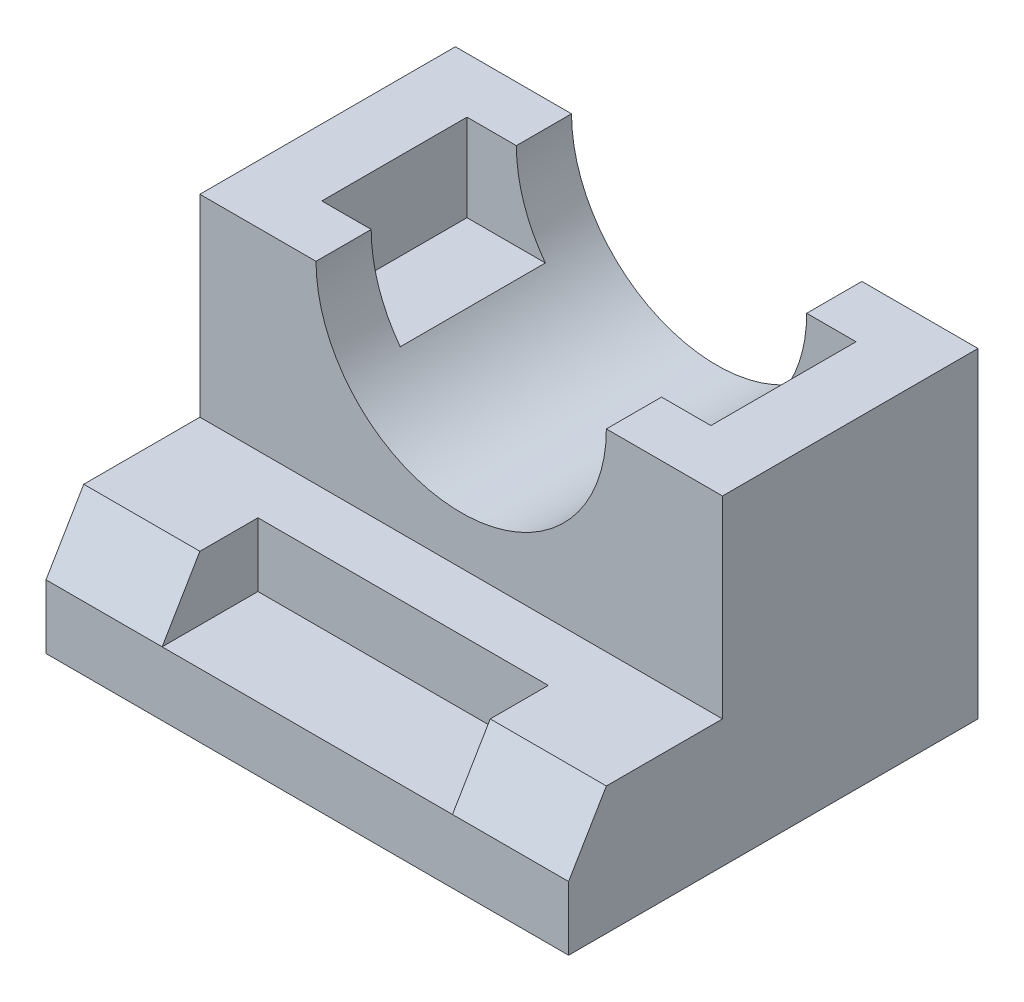
ISO-10303-21;
HEADER;
FILE_DESCRIPTION(('STEP AP214'),'2;1');
FILE_NAME('part.step','',(''),(''),'','','');
FILE_SCHEMA(('AUTOMOTIVE_DESIGN { 1 0 10303 214 1 1 1 1 }'));
ENDSEC;
DATA;
#1=APPLICATION_CONTEXT('core data for automotive mechanical design processes');
#2=APPLICATION_PROTOCOL_DEFINITION('international standard','automotive_design',2000,#1);
#3=PRODUCT_CONTEXT('',#1,'mechanical');
#4=PRODUCT('Part','Part','',(#3));
#5=PRODUCT_RELATED_PRODUCT_CATEGORY('part','',(#4));
#6=PRODUCT_DEFINITION_FORMATION('','',#4);
#7=PRODUCT_DEFINITION_CONTEXT('part definition',#1,'design');
#8=PRODUCT_DEFINITION('design','',#6,#7);
#9=PRODUCT_DEFINITION_SHAPE('','',#8);
#10=(LENGTH_UNIT() NAMED_UNIT(*) SI_UNIT(.MILLI.,.METRE.));
#11=(NAMED_UNIT(*) PLANE_ANGLE_UNIT() SI_UNIT($,.RADIAN.));
#12=(NAMED_UNIT(*) SI_UNIT($,.STERADIAN.) SOLID_ANGLE_UNIT());
#13=UNCERTAINTY_MEASURE_WITH_UNIT(LENGTH_MEASURE(1.E-05),#10,'distance_accuracy_value','');
#14=(GEOMETRIC_REPRESENTATION_CONTEXT(3) GLOBAL_UNCERTAINTY_ASSIGNED_CONTEXT((#13)) GLOBAL_UNIT_ASSIGNED_CONTEXT((#10,
#11,#12)) REPRESENTATION_CONTEXT('',''));
#15=CARTESIAN_POINT('',(0.,0.,0.));
#16=DIRECTION('',(0.,0.,1.));
#17=DIRECTION('',(1.,0.,0.));
#18=AXIS2_PLACEMENT_3D('',#15,#16,#17);
#19=CARTESIAN_POINT('',(2286.,1403.35,-1117.6));
#20=DIRECTION('',(0.,-1.,0.));
#21=DIRECTION('',(0.,0.,-1.));
#22=AXIS2_PLACEMENT_3D('',#19,#20,#21);
#23=PLANE('',#22);
#24=DIRECTION('',(0.,0.,1.));
#25=VECTOR('',#24,1.);
#26=CARTESIAN_POINT('',(1778.,1403.35,-1117.6));
#27=LINE('',#26,#25);
#28=CARTESIAN_POINT('',(1778.,1403.35,-1117.6));
#29=VERTEX_POINT('',#28);
#30=CARTESIAN_POINT('',(1778.,1403.35,-876.299999999999));
#31=VERTEX_POINT('',#30);
#32=EDGE_CURVE('E264',#29,#31,#27,.T.);
#33=ORIENTED_EDGE('',*,*,#32,.T.);
#34=DIRECTION('',(-1.,0.,0.));
#35=VECTOR('',#34,1.);
#36=CARTESIAN_POINT('',(1612.9,1403.35,-876.3));
#37=LINE('',#36,#35);
#38=CARTESIAN_POINT('',(1993.9,1403.35,-876.299999999999));
#39=VERTEX_POINT('',#38);
#40=EDGE_CURVE('E233',#39,#31,#37,.T.);
#41=ORIENTED_EDGE('',*,*,#40,.F.);
#42=DIRECTION('',(0.,0.,-1.));
#43=VECTOR('',#42,1.);
#44=CARTESIAN_POINT('',(1993.9,1403.35,-876.299999999999));
#45=LINE('',#44,#43);
#46=CARTESIAN_POINT('',(1993.9,1403.35,-241.299999999999));
#47=VERTEX_POINT('',#46);
#48=EDGE_CURVE('E236',#47,#39,#45,.T.);
#49=ORIENTED_EDGE('',*,*,#48,.F.);
#50=DIRECTION('',(1.,0.,0.));
#51=VECTOR('',#50,1.);
#52=CARTESIAN_POINT('',(1993.9,1403.35,-241.299999999999));
#53=LINE('',#52,#51);
#54=CARTESIAN_POINT('',(1778.,1403.35,-241.299999999999));
#55=VERTEX_POINT('',#54);
#56=EDGE_CURVE('E218',#55,#47,#53,.T.);
#57=ORIENTED_EDGE('',*,*,#56,.F.);
#58=CARTESIAN_POINT('',(1778.,1403.35,0.));
#59=VERTEX_POINT('',#58);
#60=EDGE_CURVE('E254',#55,#59,#27,.T.);
#61=ORIENTED_EDGE('',*,*,#60,.T.);
#62=DIRECTION('',(-1.,0.,0.));
#63=VECTOR('',#62,1.);
#64=CARTESIAN_POINT('',(2286.,1403.35,0.));
#65=LINE('',#64,#63);
#66=CARTESIAN_POINT('',(2286.,1403.35,0.));
#67=VERTEX_POINT('',#66);
#68=EDGE_CURVE('E379',#67,#59,#65,.T.);
#69=ORIENTED_EDGE('',*,*,#68,.F.);
#70=DIRECTION('',(0.,0.,1.));
#71=VECTOR('',#70,1.);
#72=CARTESIAN_POINT('',(2286.,1403.35,-1117.6));
#73=LINE('',#72,#71);
#74=CARTESIAN_POINT('',(2286.,1403.35,-1117.6));
#75=VERTEX_POINT('',#74);
#76=EDGE_CURVE('E341',#75,#67,#73,.T.);
#77=ORIENTED_EDGE('',*,*,#76,.F.);
#78=DIRECTION('',(-1.,0.,0.));
#79=VECTOR('',#78,1.);
#80=CARTESIAN_POINT('',(2286.,1403.35,-1117.6));
#81=LINE('',#80,#79);
#82=EDGE_CURVE('E370',#75,#29,#81,.T.);
#83=ORIENTED_EDGE('',*,*,#82,.T.);
#84=EDGE_LOOP('',(#33,#41,#49,#57,#61,#69,#77,#83));
#85=FACE_BOUND('',#84,.T.);
#86=ADVANCED_FACE('F43',(#85),#23,.F.);
#87=CARTESIAN_POINT('',(508.,558.8,673.1));
#88=DIRECTION('',(1.,0.,0.));
#89=DIRECTION('',(0.,0.,-1.));
#90=AXIS2_PLACEMENT_3D('',#87,#88,#89);
#91=PLANE('',#90);
#92=DIRECTION('',(0.,0.,-1.));
#93=VECTOR('',#92,1.);
#94=CARTESIAN_POINT('',(508.,279.4,673.1));
#95=LINE('',#94,#93);
#96=CARTESIAN_POINT('',(508.,279.4,673.1));
#97=VERTEX_POINT('',#96);
#98=CARTESIAN_POINT('',(508.,279.4,254.));
#99=VERTEX_POINT('',#98);
#100=EDGE_CURVE('E297',#97,#99,#95,.T.);
#101=ORIENTED_EDGE('',*,*,#100,.T.);
#102=DIRECTION('',(0.,1.,0.));
#103=VECTOR('',#102,1.);
#104=CARTESIAN_POINT('',(508.,279.4,254.));
#105=LINE('',#104,#103);
#106=CARTESIAN_POINT('',(508.,558.8,254.));
#107=VERTEX_POINT('',#106);
#108=EDGE_CURVE('E271',#99,#107,#105,.T.);
#109=ORIENTED_EDGE('',*,*,#108,.T.);
#110=DIRECTION('',(0.,0.,-1.));
#111=VECTOR('',#110,1.);
#112=CARTESIAN_POINT('',(508.,558.8,673.1));
#113=LINE('',#112,#111);
#114=CARTESIAN_POINT('',(508.,558.8,508.));
#115=VERTEX_POINT('',#114);
#116=EDGE_CURVE('E285',#115,#107,#113,.T.);
#117=ORIENTED_EDGE('',*,*,#116,.F.);
#118=DIRECTION('',(0.,-0.860926528214315,0.508729312126641));
#119=VECTOR('',#118,1.);
#120=CARTESIAN_POINT('',(508.,558.8,508.));
#121=LINE('',#120,#119);
#122=EDGE_CURVE('E386',#115,#97,#121,.T.);
#123=ORIENTED_EDGE('',*,*,#122,.T.);
#124=EDGE_LOOP('',(#101,#109,#117,#123));
#125=FACE_BOUND('',#124,.T.);
#126=ADVANCED_FACE('F473',(#125),#91,.T.);
#127=CARTESIAN_POINT('',(1778.,279.4,673.1));
#128=DIRECTION('',(-1.,0.,0.));
#129=DIRECTION('',(0.,0.,1.));
#130=AXIS2_PLACEMENT_3D('',#127,#128,#129);
#131=PLANE('',#130);
#132=DIRECTION('',(0.,0.,-1.));
#133=VECTOR('',#132,1.);
#134=CARTESIAN_POINT('',(1778.,558.8,673.1));
#135=LINE('',#134,#133);
#136=CARTESIAN_POINT('',(1778.,558.8,508.));
#137=VERTEX_POINT('',#136);
#138=CARTESIAN_POINT('',(1778.,558.8,254.));
#139=VERTEX_POINT('',#138);
#140=EDGE_CURVE('E289',#137,#139,#135,.T.);
#141=ORIENTED_EDGE('',*,*,#140,.T.);
#142=DIRECTION('',(0.,-1.,0.));
#143=VECTOR('',#142,1.);
#144=CARTESIAN_POINT('',(1778.,558.8,254.));
#145=LINE('',#144,#143);
#146=CARTESIAN_POINT('',(1778.,279.4,254.));
#147=VERTEX_POINT('',#146);
#148=EDGE_CURVE('E278',#139,#147,#145,.T.);
#149=ORIENTED_EDGE('',*,*,#148,.T.);
#150=DIRECTION('',(0.,0.,-1.));
#151=VECTOR('',#150,1.);
#152=CARTESIAN_POINT('',(1778.,279.4,673.1));
#153=LINE('',#152,#151);
#154=CARTESIAN_POINT('',(1778.,279.4,673.1));
#155=VERTEX_POINT('',#154);
#156=EDGE_CURVE('E293',#155,#147,#153,.T.);
#157=ORIENTED_EDGE('',*,*,#156,.F.);
#158=DIRECTION('',(0.,0.860926528214315,-0.508729312126641));
#159=VECTOR('',#158,1.);
#160=CARTESIAN_POINT('',(1778.,558.8,508.));
#161=LINE('',#160,#159);
#162=EDGE_CURVE('E383',#155,#137,#161,.T.);
#163=ORIENTED_EDGE('',*,*,#162,.T.);
#164=EDGE_LOOP('',(#141,#149,#157,#163));
#165=FACE_BOUND('',#164,.T.);
#166=ADVANCED_FACE('F477',(#165),#131,.T.);
#167=CARTESIAN_POINT('',(508.,279.4,673.1));
#168=DIRECTION('',(0.,1.,0.));
#169=DIRECTION('',(0.,0.,1.));
#170=AXIS2_PLACEMENT_3D('',#167,#168,#169);
#171=PLANE('',#170);
#172=ORIENTED_EDGE('',*,*,#156,.T.);
#173=DIRECTION('',(-1.,0.,0.));
#174=VECTOR('',#173,1.);
#175=CARTESIAN_POINT('',(1778.,279.4,254.));
#176=LINE('',#175,#174);
#177=EDGE_CURVE('E262',#147,#99,#176,.T.);
#178=ORIENTED_EDGE('',*,*,#177,.T.);
#179=ORIENTED_EDGE('',*,*,#100,.F.);
#180=DIRECTION('',(1.,0.,0.));
#181=VECTOR('',#180,1.);
#182=CARTESIAN_POINT('',(508.,279.4,673.1));
#183=LINE('',#182,#181);
#184=EDGE_CURVE('E282',#97,#155,#183,.T.);
#185=ORIENTED_EDGE('',*,*,#184,.T.);
#186=EDGE_LOOP('',(#172,#178,#179,#185));
#187=FACE_BOUND('',#186,.T.);
#188=ADVANCED_FACE('F497',(#187),#171,.T.);
#189=CARTESIAN_POINT('',(0.,558.8,673.1));
#190=DIRECTION('',(0.,1.,0.));
#191=DIRECTION('',(0.,0.,1.));
#192=AXIS2_PLACEMENT_3D('',#189,#190,#191);
#193=PLANE('',#192);
#194=DIRECTION('',(0.,0.,-1.));
#195=VECTOR('',#194,1.);
#196=CARTESIAN_POINT('',(2286.,558.8,673.1));
#197=LINE('',#196,#195);
#198=CARTESIAN_POINT('',(2286.,558.8,508.));
#199=VERTEX_POINT('',#198);
#200=CARTESIAN_POINT('',(2286.,558.8,0.));
#201=VERTEX_POINT('',#200);
#202=EDGE_CURVE('E334',#199,#201,#197,.T.);
#203=ORIENTED_EDGE('',*,*,#202,.T.);
#204=DIRECTION('',(1.,0.,0.));
#205=VECTOR('',#204,1.);
#206=CARTESIAN_POINT('',(0.,558.8,0.));
#207=LINE('',#206,#205);
#208=CARTESIAN_POINT('',(0.,558.8,0.));
#209=VERTEX_POINT('',#208);
#210=EDGE_CURVE('E319',#209,#201,#207,.T.);
#211=ORIENTED_EDGE('',*,*,#210,.F.);
#212=DIRECTION('',(0.,0.,-1.));
#213=VECTOR('',#212,1.);
#214=CARTESIAN_POINT('',(0.,558.8,673.1));
#215=LINE('',#214,#213);
#216=CARTESIAN_POINT('',(0.,558.8,508.));
#217=VERTEX_POINT('',#216);
#218=EDGE_CURVE('E331',#217,#209,#215,.T.);
#219=ORIENTED_EDGE('',*,*,#218,.F.);
#220=DIRECTION('',(-1.,0.,0.));
#221=VECTOR('',#220,1.);
#222=CARTESIAN_POINT('',(2286.,558.8,508.));
#223=LINE('',#222,#221);
#224=EDGE_CURVE('E306',#115,#217,#223,.T.);
#225=ORIENTED_EDGE('',*,*,#224,.F.);
#226=ORIENTED_EDGE('',*,*,#116,.T.);
#227=DIRECTION('',(1.,0.,0.));
#228=VECTOR('',#227,1.);
#229=CARTESIAN_POINT('',(508.,558.8,254.));
#230=LINE('',#229,#228);
#231=EDGE_CURVE('E275',#107,#139,#230,.T.);
#232=ORIENTED_EDGE('',*,*,#231,.T.);
#233=ORIENTED_EDGE('',*,*,#140,.F.);
#234=EDGE_CURVE('E310',#199,#137,#223,.T.);
#235=ORIENTED_EDGE('',*,*,#234,.F.);
#236=EDGE_LOOP('',(#203,#211,#219,#225,#226,#232,#233,#235));
#237=FACE_BOUND('',#236,.T.);
#238=ADVANCED_FACE('F453',(#237),#193,.T.);
#239=CARTESIAN_POINT('',(2286.,558.8,508.));
#240=DIRECTION('',(0.,-0.508729312126641,-0.860926528214315));
#241=DIRECTION('',(0.,0.860926528214315,-0.508729312126641));
#242=AXIS2_PLACEMENT_3D('',#239,#240,#241);
#243=PLANE('',#242);
#244=ORIENTED_EDGE('',*,*,#122,.F.);
#245=ORIENTED_EDGE('',*,*,#224,.T.);
#246=DIRECTION('',(0.,-0.860926528214315,0.508729312126641));
#247=VECTOR('',#246,1.);
#248=CARTESIAN_POINT('',(0.,558.8,508.));
#249=LINE('',#248,#247);
#250=CARTESIAN_POINT('',(0.,279.4,673.1));
#251=VERTEX_POINT('',#250);
#252=EDGE_CURVE('E301',#217,#251,#249,.T.);
#253=ORIENTED_EDGE('',*,*,#252,.T.);
#254=DIRECTION('',(-1.,0.,0.));
#255=VECTOR('',#254,1.);
#256=CARTESIAN_POINT('',(2286.,279.4,673.1));
#257=LINE('',#256,#255);
#258=EDGE_CURVE('E314',#97,#251,#257,.T.);
#259=ORIENTED_EDGE('',*,*,#258,.F.);
#260=EDGE_LOOP('',(#244,#245,#253,#259));
#261=FACE_BOUND('',#260,.T.);
#262=ADVANCED_FACE('F449',(#261),#243,.F.);
#263=ORIENTED_EDGE('',*,*,#162,.F.);
#264=CARTESIAN_POINT('',(2286.,279.4,673.1));
#265=VERTEX_POINT('',#264);
#266=EDGE_CURVE('E315',#265,#155,#257,.T.);
#267=ORIENTED_EDGE('',*,*,#266,.F.);
#268=DIRECTION('',(0.,-0.860926528214315,0.508729312126641));
#269=VECTOR('',#268,1.);
#270=CARTESIAN_POINT('',(2286.,558.8,508.));
#271=LINE('',#270,#269);
#272=EDGE_CURVE('E302',#199,#265,#271,.T.);
#273=ORIENTED_EDGE('',*,*,#272,.F.);
#274=ORIENTED_EDGE('',*,*,#234,.T.);
#275=EDGE_LOOP('',(#263,#267,#273,#274));
#276=FACE_BOUND('',#275,.T.);
#277=ADVANCED_FACE('F481',(#276),#243,.F.);
#278=DIRECTION('',(0.,0.,1.));
#279=VECTOR('',#278,1.);
#280=CARTESIAN_POINT('',(292.1,1403.35,-876.3));
#281=LINE('',#280,#279);
#282=CARTESIAN_POINT('',(292.1,1403.35,-876.3));
#283=VERTEX_POINT('',#282);
#284=CARTESIAN_POINT('',(292.1,1403.35,-241.3));
#285=VERTEX_POINT('',#284);
#286=EDGE_CURVE('E217',#283,#285,#281,.T.);
#287=ORIENTED_EDGE('',*,*,#286,.F.);
#288=DIRECTION('',(-1.,0.,0.));
#289=VECTOR('',#288,1.);
#290=CARTESIAN_POINT('',(673.1,1403.35,-876.3));
#291=LINE('',#290,#289);
#292=CARTESIAN_POINT('',(508.,1403.35,-876.3));
#293=VERTEX_POINT('',#292);
#294=EDGE_CURVE('E202',#293,#283,#291,.T.);
#295=ORIENTED_EDGE('',*,*,#294,.F.);
#296=DIRECTION('',(0.,0.,1.));
#297=VECTOR('',#296,1.);
#298=CARTESIAN_POINT('',(508.,1403.35,-1117.6));
#299=LINE('',#298,#297);
#300=CARTESIAN_POINT('',(508.,1403.35,-1117.6));
#301=VERTEX_POINT('',#300);
#302=EDGE_CURVE('E258',#301,#293,#299,.T.);
#303=ORIENTED_EDGE('',*,*,#302,.F.);
#304=CARTESIAN_POINT('',(0.,1403.35,-1117.6));
#305=VERTEX_POINT('',#304);
#306=EDGE_CURVE('E356',#301,#305,#81,.T.);
#307=ORIENTED_EDGE('',*,*,#306,.T.);
#308=DIRECTION('',(0.,0.,1.));
#309=VECTOR('',#308,1.);
#310=CARTESIAN_POINT('',(0.,1403.35,-1117.6));
#311=LINE('',#310,#309);
#312=CARTESIAN_POINT('',(0.,1403.35,0.));
#313=VERTEX_POINT('',#312);
#314=EDGE_CURVE('E338',#305,#313,#311,.T.);
#315=ORIENTED_EDGE('',*,*,#314,.T.);
#316=CARTESIAN_POINT('',(508.,1403.35,0.));
#317=VERTEX_POINT('',#316);
#318=EDGE_CURVE('E378',#317,#313,#65,.T.);
#319=ORIENTED_EDGE('',*,*,#318,.F.);
#320=CARTESIAN_POINT('',(508.,1403.35,-241.3));
#321=VERTEX_POINT('',#320);
#322=EDGE_CURVE('E263',#321,#317,#299,.T.);
#323=ORIENTED_EDGE('',*,*,#322,.F.);
#324=DIRECTION('',(1.,0.,0.));
#325=VECTOR('',#324,1.);
#326=CARTESIAN_POINT('',(292.1,1403.35,-241.3));
#327=LINE('',#326,#325);
#328=EDGE_CURVE('E196',#285,#321,#327,.T.);
#329=ORIENTED_EDGE('',*,*,#328,.F.);
#330=EDGE_LOOP('',(#287,#295,#303,#307,#315,#319,#323,#329));
#331=FACE_BOUND('',#330,.T.);
#332=ADVANCED_FACE('F45',(#331),#23,.F.);
#333=CARTESIAN_POINT('',(2286.,1403.35,0.));
#334=DIRECTION('',(0.,0.,-1.));
#335=DIRECTION('',(-1.,0.,0.));
#336=AXIS2_PLACEMENT_3D('',#333,#334,#335);
#337=PLANE('',#336);
#338=ORIENTED_EDGE('',*,*,#68,.T.);
#339=CARTESIAN_POINT('',(1143.,1403.35,0.));
#340=DIRECTION('',(0.,0.,1.));
#341=DIRECTION('',(1.,0.,0.));
#342=AXIS2_PLACEMENT_3D('',#339,#340,#341);
#343=CIRCLE('',#342,635.);
#344=EDGE_CURVE('E224',#317,#59,#343,.T.);
#345=ORIENTED_EDGE('',*,*,#344,.F.);
#346=ORIENTED_EDGE('',*,*,#318,.T.);
#347=DIRECTION('',(0.,-1.,0.));
#348=VECTOR('',#347,1.);
#349=CARTESIAN_POINT('',(0.,1403.35,0.));
#350=LINE('',#349,#348);
#351=EDGE_CURVE('E360',#313,#209,#350,.T.);
#352=ORIENTED_EDGE('',*,*,#351,.T.);
#353=ORIENTED_EDGE('',*,*,#210,.T.);
#354=DIRECTION('',(0.,-1.,0.));
#355=VECTOR('',#354,1.);
#356=CARTESIAN_POINT('',(2286.,1403.35,0.));
#357=LINE('',#356,#355);
#358=EDGE_CURVE('E345',#67,#201,#357,.T.);
#359=ORIENTED_EDGE('',*,*,#358,.F.);
#360=EDGE_LOOP('',(#338,#345,#346,#352,#353,#359));
#361=FACE_BOUND('',#360,.T.);
#362=ADVANCED_FACE('F422',(#361),#337,.F.);
#363=CARTESIAN_POINT('',(2286.,0.,0.));
#364=DIRECTION('',(0.,1.,0.));
#365=DIRECTION('',(0.,0.,1.));
#366=AXIS2_PLACEMENT_3D('',#363,#364,#365);
#367=PLANE('',#366);
#368=DIRECTION('',(0.,0.,-1.));
#369=VECTOR('',#368,1.);
#370=CARTESIAN_POINT('',(0.,0.,0.));
#371=LINE('',#370,#369);
#372=CARTESIAN_POINT('',(0.,0.,673.1));
#373=VERTEX_POINT('',#372);
#374=CARTESIAN_POINT('',(0.,0.,-1117.6));
#375=VERTEX_POINT('',#374);
#376=EDGE_CURVE('E364',#373,#375,#371,.T.);
#377=ORIENTED_EDGE('',*,*,#376,.T.);
#378=DIRECTION('',(-1.,0.,0.));
#379=VECTOR('',#378,1.);
#380=CARTESIAN_POINT('',(2286.,0.,-1117.6));
#381=LINE('',#380,#379);
#382=CARTESIAN_POINT('',(2286.,0.,-1117.6));
#383=VERTEX_POINT('',#382);
#384=EDGE_CURVE('E374',#383,#375,#381,.T.);
#385=ORIENTED_EDGE('',*,*,#384,.F.);
#386=DIRECTION('',(0.,0.,-1.));
#387=VECTOR('',#386,1.);
#388=CARTESIAN_POINT('',(2286.,0.,0.));
#389=LINE('',#388,#387);
#390=CARTESIAN_POINT('',(2286.,0.,673.1));
#391=VERTEX_POINT('',#390);
#392=EDGE_CURVE('E350',#391,#383,#389,.T.);
#393=ORIENTED_EDGE('',*,*,#392,.F.);
#394=DIRECTION('',(-1.,0.,0.));
#395=VECTOR('',#394,1.);
#396=CARTESIAN_POINT('',(2286.,0.,673.1));
#397=LINE('',#396,#395);
#398=EDGE_CURVE('E323',#391,#373,#397,.T.);
#399=ORIENTED_EDGE('',*,*,#398,.T.);
#400=EDGE_LOOP('',(#377,#385,#393,#399));
#401=FACE_BOUND('',#400,.T.);
#402=ADVANCED_FACE('F464',(#401),#367,.F.);
#403=CARTESIAN_POINT('',(2286.,0.,-1117.6));
#404=DIRECTION('',(0.,0.,1.));
#405=DIRECTION('',(1.,0.,0.));
#406=AXIS2_PLACEMENT_3D('',#403,#404,#405);
#407=PLANE('',#406);
#408=ORIENTED_EDGE('',*,*,#306,.F.);
#409=CARTESIAN_POINT('',(1143.,1403.35,-1117.6));
#410=DIRECTION('',(0.,0.,1.));
#411=DIRECTION('',(1.,0.,0.));
#412=AXIS2_PLACEMENT_3D('',#409,#410,#411);
#413=CIRCLE('',#412,635.);
#414=EDGE_CURVE('E250',#301,#29,#413,.T.);
#415=ORIENTED_EDGE('',*,*,#414,.T.);
#416=ORIENTED_EDGE('',*,*,#82,.F.);
#417=DIRECTION('',(0.,1.,0.));
#418=VECTOR('',#417,1.);
#419=CARTESIAN_POINT('',(2286.,0.,-1117.6));
#420=LINE('',#419,#418);
#421=EDGE_CURVE('E353',#383,#75,#420,.T.);
#422=ORIENTED_EDGE('',*,*,#421,.F.);
#423=ORIENTED_EDGE('',*,*,#384,.T.);
#424=DIRECTION('',(0.,1.,0.));
#425=VECTOR('',#424,1.);
#426=CARTESIAN_POINT('',(0.,0.,-1117.6));
#427=LINE('',#426,#425);
#428=EDGE_CURVE('E346',#375,#305,#427,.T.);
#429=ORIENTED_EDGE('',*,*,#428,.T.);
#430=EDGE_LOOP('',(#408,#415,#416,#422,#423,#429));
#431=FACE_BOUND('',#430,.T.);
#432=ADVANCED_FACE('F432',(#431),#407,.F.);
#433=CARTESIAN_POINT('',(2286.,0.,0.));
#434=DIRECTION('',(1.,0.,0.));
#435=DIRECTION('',(0.,0.,-1.));
#436=AXIS2_PLACEMENT_3D('',#433,#434,#435);
#437=PLANE('',#436);
#438=ORIENTED_EDGE('',*,*,#272,.T.);
#439=DIRECTION('',(0.,-1.,0.));
#440=VECTOR('',#439,1.);
#441=CARTESIAN_POINT('',(2286.,558.8,673.1));
#442=LINE('',#441,#440);
#443=EDGE_CURVE('E320',#265,#391,#442,.T.);
#444=ORIENTED_EDGE('',*,*,#443,.T.);
#445=ORIENTED_EDGE('',*,*,#392,.T.);
#446=ORIENTED_EDGE('',*,*,#421,.T.);
#447=ORIENTED_EDGE('',*,*,#76,.T.);
#448=ORIENTED_EDGE('',*,*,#358,.T.);
#449=ORIENTED_EDGE('',*,*,#202,.F.);
#450=EDGE_LOOP('',(#438,#444,#445,#446,#447,#448,#449));
#451=FACE_BOUND('',#450,.T.);
#452=ADVANCED_FACE('F426',(#451),#437,.T.);
#453=CARTESIAN_POINT('',(0.,0.,0.));
#454=DIRECTION('',(1.,0.,0.));
#455=DIRECTION('',(0.,0.,-1.));
#456=AXIS2_PLACEMENT_3D('',#453,#454,#455);
#457=PLANE('',#456);
#458=DIRECTION('',(0.,1.,0.));
#459=VECTOR('',#458,1.);
#460=CARTESIAN_POINT('',(0.,0.,673.1));
#461=LINE('',#460,#459);
#462=EDGE_CURVE('E327',#373,#251,#461,.T.);
#463=ORIENTED_EDGE('',*,*,#462,.T.);
#464=ORIENTED_EDGE('',*,*,#252,.F.);
#465=ORIENTED_EDGE('',*,*,#218,.T.);
#466=ORIENTED_EDGE('',*,*,#351,.F.);
#467=ORIENTED_EDGE('',*,*,#314,.F.);
#468=ORIENTED_EDGE('',*,*,#428,.F.);
#469=ORIENTED_EDGE('',*,*,#376,.F.);
#470=EDGE_LOOP('',(#463,#464,#465,#466,#467,#468,#469));
#471=FACE_BOUND('',#470,.T.);
#472=ADVANCED_FACE('F440',(#471),#457,.F.);
#473=CARTESIAN_POINT('',(0.,0.,673.1));
#474=DIRECTION('',(0.,0.,-1.));
#475=DIRECTION('',(-1.,0.,0.));
#476=AXIS2_PLACEMENT_3D('',#473,#474,#475);
#477=PLANE('',#476);
#478=ORIENTED_EDGE('',*,*,#443,.F.);
#479=ORIENTED_EDGE('',*,*,#266,.T.);
#480=ORIENTED_EDGE('',*,*,#184,.F.);
#481=ORIENTED_EDGE('',*,*,#258,.T.);
#482=ORIENTED_EDGE('',*,*,#462,.F.);
#483=ORIENTED_EDGE('',*,*,#398,.F.);
#484=EDGE_LOOP('',(#478,#479,#480,#481,#482,#483));
#485=FACE_BOUND('',#484,.T.);
#486=ADVANCED_FACE('F461',(#485),#477,.F.);
#487=CARTESIAN_POINT('',(0.,0.,254.));
#488=DIRECTION('',(0.,0.,-1.));
#489=DIRECTION('',(-1.,0.,0.));
#490=AXIS2_PLACEMENT_3D('',#487,#488,#489);
#491=PLANE('',#490);
#492=ORIENTED_EDGE('',*,*,#177,.F.);
#493=ORIENTED_EDGE('',*,*,#148,.F.);
#494=ORIENTED_EDGE('',*,*,#231,.F.);
#495=ORIENTED_EDGE('',*,*,#108,.F.);
#496=EDGE_LOOP('',(#492,#493,#494,#495));
#497=FACE_BOUND('',#496,.T.);
#498=ADVANCED_FACE('F494',(#497),#491,.F.);
#499=CARTESIAN_POINT('',(1143.,1403.35,-1117.6));
#500=DIRECTION('',(0.,0.,1.));
#501=DIRECTION('',(1.,0.,0.));
#502=AXIS2_PLACEMENT_3D('',#499,#500,#501);
#503=CYLINDRICAL_SURFACE('',#502,635.);
#504=ORIENTED_EDGE('',*,*,#302,.T.);
#505=CARTESIAN_POINT('',(1143.,1403.35,-876.3));
#506=DIRECTION('',(0.,0.,-1.));
#507=DIRECTION('',(-1.,0.,0.));
#508=AXIS2_PLACEMENT_3D('',#505,#506,#507);
#509=CIRCLE('',#508,635.);
#510=CARTESIAN_POINT('',(635.,1022.35,-876.3));
#511=VERTEX_POINT('',#510);
#512=EDGE_CURVE('E11',#293,#511,#509,.F.);
#513=ORIENTED_EDGE('',*,*,#512,.T.);
#514=DIRECTION('',(0.,0.,1.));
#515=VECTOR('',#514,1.);
#516=CARTESIAN_POINT('',(635.,1022.35,-1117.6));
#517=LINE('',#516,#515);
#518=CARTESIAN_POINT('',(635.,1022.35,-241.3));
#519=VERTEX_POINT('',#518);
#520=EDGE_CURVE('E193',#519,#511,#517,.F.);
#521=ORIENTED_EDGE('',*,*,#520,.F.);
#522=CARTESIAN_POINT('',(1143.,1403.35,-241.3));
#523=DIRECTION('',(0.,0.,1.));
#524=DIRECTION('',(1.,0.,0.));
#525=AXIS2_PLACEMENT_3D('',#522,#523,#524);
#526=CIRCLE('',#525,635.);
#527=EDGE_CURVE('E52',#519,#321,#526,.F.);
#528=ORIENTED_EDGE('',*,*,#527,.T.);
#529=ORIENTED_EDGE('',*,*,#322,.T.);
#530=ORIENTED_EDGE('',*,*,#344,.T.);
#531=ORIENTED_EDGE('',*,*,#60,.F.);
#532=CARTESIAN_POINT('',(1143.,1403.35,-241.3));
#533=DIRECTION('',(0.,0.,1.));
#534=DIRECTION('',(1.,0.,0.));
#535=AXIS2_PLACEMENT_3D('',#532,#533,#534);
#536=CIRCLE('',#535,635.);
#537=CARTESIAN_POINT('',(1651.,1022.35,-241.299999999999));
#538=VERTEX_POINT('',#537);
#539=EDGE_CURVE('E394',#55,#538,#536,.F.);
#540=ORIENTED_EDGE('',*,*,#539,.T.);
#541=DIRECTION('',(0.,0.,1.));
#542=VECTOR('',#541,1.);
#543=CARTESIAN_POINT('',(1651.,1022.35,-1117.6));
#544=LINE('',#543,#542);
#545=CARTESIAN_POINT('',(1651.,1022.35,-876.3));
#546=VERTEX_POINT('',#545);
#547=EDGE_CURVE('E390',#538,#546,#544,.F.);
#548=ORIENTED_EDGE('',*,*,#547,.T.);
#549=CARTESIAN_POINT('',(1143.,1403.35,-876.3));
#550=DIRECTION('',(0.,0.,-1.));
#551=DIRECTION('',(-1.,0.,0.));
#552=AXIS2_PLACEMENT_3D('',#549,#550,#551);
#553=CIRCLE('',#552,635.);
#554=EDGE_CURVE('E398',#546,#31,#553,.F.);
#555=ORIENTED_EDGE('',*,*,#554,.T.);
#556=ORIENTED_EDGE('',*,*,#32,.F.);
#557=ORIENTED_EDGE('',*,*,#414,.F.);
#558=EDGE_LOOP('',(#504,#513,#521,#528,#529,#530,#531,#540,#548,#555,#556,#557));
#559=FACE_BOUND('',#558,.T.);
#560=ADVANCED_FACE('F407',(#559),#503,.F.);
#561=CARTESIAN_POINT('',(1612.9,1022.35,-876.3));
#562=DIRECTION('',(0.,0.,-1.));
#563=DIRECTION('',(-1.,0.,0.));
#564=AXIS2_PLACEMENT_3D('',#561,#562,#563);
#565=PLANE('',#564);
#566=DIRECTION('',(-1.,0.,0.));
#567=VECTOR('',#566,1.);
#568=CARTESIAN_POINT('',(1612.9,1022.35,-876.3));
#569=LINE('',#568,#567);
#570=CARTESIAN_POINT('',(1993.9,1022.35,-876.299999999999));
#571=VERTEX_POINT('',#570);
#572=EDGE_CURVE('E67',#571,#546,#569,.T.);
#573=ORIENTED_EDGE('',*,*,#572,.F.);
#574=DIRECTION('',(0.,1.,0.));
#575=VECTOR('',#574,1.);
#576=CARTESIAN_POINT('',(1993.9,1022.35,-876.299999999999));
#577=LINE('',#576,#575);
#578=EDGE_CURVE('E230',#571,#39,#577,.T.);
#579=ORIENTED_EDGE('',*,*,#578,.T.);
#580=ORIENTED_EDGE('',*,*,#40,.T.);
#581=ORIENTED_EDGE('',*,*,#554,.F.);
#582=EDGE_LOOP('',(#573,#579,#580,#581));
#583=FACE_BOUND('',#582,.T.);
#584=ADVANCED_FACE('F526',(#583),#565,.F.);
#585=CARTESIAN_POINT('',(1993.9,1022.35,-241.299999999999));
#586=DIRECTION('',(0.,0.,1.));
#587=DIRECTION('',(1.,0.,0.));
#588=AXIS2_PLACEMENT_3D('',#585,#586,#587);
#589=PLANE('',#588);
#590=ORIENTED_EDGE('',*,*,#56,.T.);
#591=DIRECTION('',(0.,1.,0.));
#592=VECTOR('',#591,1.);
#593=CARTESIAN_POINT('',(1993.9,1022.35,-241.299999999999));
#594=LINE('',#593,#592);
#595=CARTESIAN_POINT('',(1993.9,1022.35,-241.299999999999));
#596=VERTEX_POINT('',#595);
#597=EDGE_CURVE('E226',#596,#47,#594,.T.);
#598=ORIENTED_EDGE('',*,*,#597,.F.);
#599=DIRECTION('',(1.,0.,0.));
#600=VECTOR('',#599,1.);
#601=CARTESIAN_POINT('',(1993.9,1022.35,-241.299999999999));
#602=LINE('',#601,#600);
#603=EDGE_CURVE('E237',#538,#596,#602,.T.);
#604=ORIENTED_EDGE('',*,*,#603,.F.);
#605=ORIENTED_EDGE('',*,*,#539,.F.);
#606=EDGE_LOOP('',(#590,#598,#604,#605));
#607=FACE_BOUND('',#606,.T.);
#608=ADVANCED_FACE('F533',(#607),#589,.F.);
#609=CARTESIAN_POINT('',(0.,1022.35,0.));
#610=DIRECTION('',(0.,-1.,0.));
#611=DIRECTION('',(0.,0.,-1.));
#612=AXIS2_PLACEMENT_3D('',#609,#610,#611);
#613=PLANE('',#612);
#614=ORIENTED_EDGE('',*,*,#603,.T.);
#615=DIRECTION('',(0.,0.,-1.));
#616=VECTOR('',#615,1.);
#617=CARTESIAN_POINT('',(1993.9,1022.35,-876.299999999999));
#618=LINE('',#617,#616);
#619=EDGE_CURVE('E245',#596,#571,#618,.T.);
#620=ORIENTED_EDGE('',*,*,#619,.T.);
#621=ORIENTED_EDGE('',*,*,#572,.T.);
#622=ORIENTED_EDGE('',*,*,#547,.F.);
#623=EDGE_LOOP('',(#614,#620,#621,#622));
#624=FACE_BOUND('',#623,.T.);
#625=ADVANCED_FACE('F541',(#624),#613,.F.);
#626=CARTESIAN_POINT('',(1993.9,1022.35,-876.299999999999));
#627=DIRECTION('',(1.,0.,0.));
#628=DIRECTION('',(0.,0.,-1.));
#629=AXIS2_PLACEMENT_3D('',#626,#627,#628);
#630=PLANE('',#629);
#631=ORIENTED_EDGE('',*,*,#48,.T.);
#632=ORIENTED_EDGE('',*,*,#578,.F.);
#633=ORIENTED_EDGE('',*,*,#619,.F.);
#634=ORIENTED_EDGE('',*,*,#597,.T.);
#635=EDGE_LOOP('',(#631,#632,#633,#634));
#636=FACE_BOUND('',#635,.T.);
#637=ADVANCED_FACE('F549',(#636),#630,.F.);
#638=CARTESIAN_POINT('',(673.1,1022.35,-876.3));
#639=DIRECTION('',(0.,0.,-1.));
#640=DIRECTION('',(-1.,0.,0.));
#641=AXIS2_PLACEMENT_3D('',#638,#639,#640);
#642=PLANE('',#641);
#643=ORIENTED_EDGE('',*,*,#294,.T.);
#644=DIRECTION('',(0.,1.,0.));
#645=VECTOR('',#644,1.);
#646=CARTESIAN_POINT('',(292.1,1022.35,-876.3));
#647=LINE('',#646,#645);
#648=CARTESIAN_POINT('',(292.1,1022.35,-876.3));
#649=VERTEX_POINT('',#648);
#650=EDGE_CURVE('E199',#649,#283,#647,.T.);
#651=ORIENTED_EDGE('',*,*,#650,.F.);
#652=DIRECTION('',(-1.,0.,0.));
#653=VECTOR('',#652,1.);
#654=CARTESIAN_POINT('',(673.1,1022.35,-876.3));
#655=LINE('',#654,#653);
#656=EDGE_CURVE('E187',#511,#649,#655,.T.);
#657=ORIENTED_EDGE('',*,*,#656,.F.);
#658=ORIENTED_EDGE('',*,*,#512,.F.);
#659=EDGE_LOOP('',(#643,#651,#657,#658));
#660=FACE_BOUND('',#659,.T.);
#661=ADVANCED_FACE('F200',(#660),#642,.F.);
#662=CARTESIAN_POINT('',(292.1,1022.35,-241.3));
#663=DIRECTION('',(0.,0.,1.));
#664=DIRECTION('',(1.,0.,0.));
#665=AXIS2_PLACEMENT_3D('',#662,#663,#664);
#666=PLANE('',#665);
#667=DIRECTION('',(1.,0.,0.));
#668=VECTOR('',#667,1.);
#669=CARTESIAN_POINT('',(292.1,1022.35,-241.3));
#670=LINE('',#669,#668);
#671=CARTESIAN_POINT('',(292.1,1022.35,-241.3));
#672=VERTEX_POINT('',#671);
#673=EDGE_CURVE('E59',#672,#519,#670,.T.);
#674=ORIENTED_EDGE('',*,*,#673,.F.);
#675=DIRECTION('',(0.,1.,0.));
#676=VECTOR('',#675,1.);
#677=CARTESIAN_POINT('',(292.1,1022.35,-241.3));
#678=LINE('',#677,#676);
#679=EDGE_CURVE('E207',#672,#285,#678,.T.);
#680=ORIENTED_EDGE('',*,*,#679,.T.);
#681=ORIENTED_EDGE('',*,*,#328,.T.);
#682=ORIENTED_EDGE('',*,*,#527,.F.);
#683=EDGE_LOOP('',(#674,#680,#681,#682));
#684=FACE_BOUND('',#683,.T.);
#685=ADVANCED_FACE('F563',(#684),#666,.F.);
#686=CARTESIAN_POINT('',(0.,1022.35,0.));
#687=DIRECTION('',(0.,1.,0.));
#688=DIRECTION('',(0.,0.,1.));
#689=AXIS2_PLACEMENT_3D('',#686,#687,#688);
#690=PLANE('',#689);
#691=ORIENTED_EDGE('',*,*,#520,.T.);
#692=ORIENTED_EDGE('',*,*,#656,.T.);
#693=DIRECTION('',(0.,0.,1.));
#694=VECTOR('',#693,1.);
#695=CARTESIAN_POINT('',(292.1,1022.35,-876.3));
#696=LINE('',#695,#694);
#697=EDGE_CURVE('E191',#649,#672,#696,.T.);
#698=ORIENTED_EDGE('',*,*,#697,.T.);
#699=ORIENTED_EDGE('',*,*,#673,.T.);
#700=EDGE_LOOP('',(#691,#692,#698,#699));
#701=FACE_BOUND('',#700,.T.);
#702=ADVANCED_FACE('F189',(#701),#690,.T.);
#703=CARTESIAN_POINT('',(292.1,1022.35,-876.3));
#704=DIRECTION('',(-1.,0.,0.));
#705=DIRECTION('',(0.,0.,1.));
#706=AXIS2_PLACEMENT_3D('',#703,#704,#705);
#707=PLANE('',#706);
#708=ORIENTED_EDGE('',*,*,#286,.T.);
#709=ORIENTED_EDGE('',*,*,#679,.F.);
#710=ORIENTED_EDGE('',*,*,#697,.F.);
#711=ORIENTED_EDGE('',*,*,#650,.T.);
#712=EDGE_LOOP('',(#708,#709,#710,#711));
#713=FACE_BOUND('',#712,.T.);
#714=ADVANCED_FACE('F209',(#713),#707,.F.);
#715=CLOSED_SHELL('',(#86,#126,#166,#188,#238,#262,#277,#332,#362,#402,#432,#452,#472,#486,#498,
#560,#584,#608,#625,#637,#661,#685,#702,#714));
#716=MANIFOLD_SOLID_BREP('B2',#715);
#717=ADVANCED_BREP_SHAPE_REPRESENTATION('',(#18,#716),#14);
#718=SHAPE_DEFINITION_REPRESENTATION(#9,#717);
ENDSEC;
END-ISO-10303-21;
